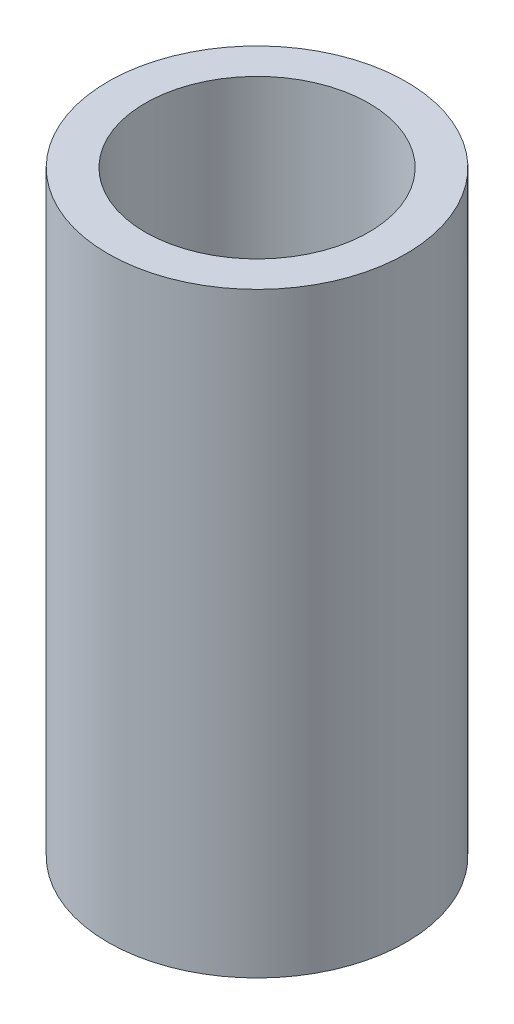
ISO-10303-21;
HEADER;
FILE_DESCRIPTION(('STEP AP214'),'2;1');
FILE_NAME('part.step','',(''),(''),'','','');
FILE_SCHEMA(('AUTOMOTIVE_DESIGN { 1 0 10303 214 1 1 1 1 }'));
ENDSEC;
DATA;
#1=APPLICATION_CONTEXT('core data for automotive mechanical design processes');
#2=APPLICATION_PROTOCOL_DEFINITION('international standard','automotive_design',2000,#1);
#3=PRODUCT_CONTEXT('',#1,'mechanical');
#4=PRODUCT('Part','Part','',(#3));
#5=PRODUCT_RELATED_PRODUCT_CATEGORY('part','',(#4));
#6=PRODUCT_DEFINITION_FORMATION('','',#4);
#7=PRODUCT_DEFINITION_CONTEXT('part definition',#1,'design');
#8=PRODUCT_DEFINITION('design','',#6,#7);
#9=PRODUCT_DEFINITION_SHAPE('','',#8);
#10=(LENGTH_UNIT() NAMED_UNIT(*) SI_UNIT(.MILLI.,.METRE.));
#11=(NAMED_UNIT(*) PLANE_ANGLE_UNIT() SI_UNIT($,.RADIAN.));
#12=(NAMED_UNIT(*) SI_UNIT($,.STERADIAN.) SOLID_ANGLE_UNIT());
#13=UNCERTAINTY_MEASURE_WITH_UNIT(LENGTH_MEASURE(1.E-05),#10,'distance_accuracy_value','');
#14=(GEOMETRIC_REPRESENTATION_CONTEXT(3) GLOBAL_UNCERTAINTY_ASSIGNED_CONTEXT((#13)) GLOBAL_UNIT_ASSIGNED_CONTEXT((#10,
#11,#12)) REPRESENTATION_CONTEXT('',''));
#15=CARTESIAN_POINT('',(0.,0.,0.));
#16=DIRECTION('',(0.,0.,1.));
#17=DIRECTION('',(1.,0.,0.));
#18=AXIS2_PLACEMENT_3D('',#15,#16,#17);
#19=CARTESIAN_POINT('',(0.,16.,0.));
#20=DIRECTION('',(0.,1.,0.));
#21=DIRECTION('',(0.,0.,1.));
#22=AXIS2_PLACEMENT_3D('',#19,#20,#21);
#23=PLANE('',#22);
#24=CARTESIAN_POINT('',(0.,16.,0.));
#25=DIRECTION('',(0.,1.,0.));
#26=DIRECTION('',(0.,0.,1.));
#27=AXIS2_PLACEMENT_3D('',#24,#25,#26);
#28=CIRCLE('',#27,4.);
#29=CARTESIAN_POINT('',(0.,16.,4.));
#30=VERTEX_POINT('',#29);
#31=EDGE_CURVE('E10',#30,#30,#28,.T.);
#32=ORIENTED_EDGE('',*,*,#31,.T.);
#33=EDGE_LOOP('',(#32));
#34=FACE_BOUND('',#33,.T.);
#35=CARTESIAN_POINT('',(0.,16.,0.));
#36=DIRECTION('',(0.,1.,0.));
#37=DIRECTION('',(0.,0.,1.));
#38=AXIS2_PLACEMENT_3D('',#35,#36,#37);
#39=CIRCLE('',#38,3.);
#40=CARTESIAN_POINT('',(0.,16.,3.));
#41=VERTEX_POINT('',#40);
#42=EDGE_CURVE('E58',#41,#41,#39,.T.);
#43=ORIENTED_EDGE('',*,*,#42,.F.);
#44=EDGE_LOOP('',(#43));
#45=FACE_BOUND('',#44,.T.);
#46=ADVANCED_FACE('F45',(#34,#45),#23,.T.);
#47=CARTESIAN_POINT('',(0.,0.,0.));
#48=DIRECTION('',(0.,1.,0.));
#49=DIRECTION('',(0.,0.,1.));
#50=AXIS2_PLACEMENT_3D('',#47,#48,#49);
#51=PLANE('',#50);
#52=CARTESIAN_POINT('',(0.,0.,0.));
#53=DIRECTION('',(0.,1.,0.));
#54=DIRECTION('',(0.,0.,1.));
#55=AXIS2_PLACEMENT_3D('',#52,#53,#54);
#56=CIRCLE('',#55,4.);
#57=CARTESIAN_POINT('',(0.,0.,4.));
#58=VERTEX_POINT('',#57);
#59=EDGE_CURVE('E49',#58,#58,#56,.T.);
#60=ORIENTED_EDGE('',*,*,#59,.F.);
#61=EDGE_LOOP('',(#60));
#62=FACE_BOUND('',#61,.T.);
#63=CARTESIAN_POINT('',(0.,0.,0.));
#64=DIRECTION('',(0.,1.,0.));
#65=DIRECTION('',(0.,0.,1.));
#66=AXIS2_PLACEMENT_3D('',#63,#64,#65);
#67=CIRCLE('',#66,3.);
#68=CARTESIAN_POINT('',(0.,0.,3.));
#69=VERTEX_POINT('',#68);
#70=EDGE_CURVE('E60',#69,#69,#67,.T.);
#71=ORIENTED_EDGE('',*,*,#70,.T.);
#72=EDGE_LOOP('',(#71));
#73=FACE_BOUND('',#72,.T.);
#74=ADVANCED_FACE('F72',(#62,#73),#51,.F.);
#75=CARTESIAN_POINT('',(0.,16.,0.));
#76=DIRECTION('',(0.,-1.,0.));
#77=DIRECTION('',(0.,0.,-1.));
#78=AXIS2_PLACEMENT_3D('',#75,#76,#77);
#79=CYLINDRICAL_SURFACE('',#78,4.);
#80=ORIENTED_EDGE('',*,*,#31,.F.);
#81=EDGE_LOOP('',(#80));
#82=FACE_BOUND('',#81,.T.);
#83=ORIENTED_EDGE('',*,*,#59,.T.);
#84=EDGE_LOOP('',(#83));
#85=FACE_BOUND('',#84,.T.);
#86=ADVANCED_FACE('F47',(#82,#85),#79,.T.);
#87=CARTESIAN_POINT('',(0.,16.,0.));
#88=DIRECTION('',(0.,-1.,0.));
#89=DIRECTION('',(0.,0.,-1.));
#90=AXIS2_PLACEMENT_3D('',#87,#88,#89);
#91=CYLINDRICAL_SURFACE('',#90,3.);
#92=ORIENTED_EDGE('',*,*,#42,.T.);
#93=EDGE_LOOP('',(#92));
#94=FACE_BOUND('',#93,.T.);
#95=ORIENTED_EDGE('',*,*,#70,.F.);
#96=EDGE_LOOP('',(#95));
#97=FACE_BOUND('',#96,.T.);
#98=ADVANCED_FACE('F68',(#94,#97),#91,.F.);
#99=CLOSED_SHELL('',(#46,#74,#86,#98));
#100=MANIFOLD_SOLID_BREP('B2',#99);
#101=ADVANCED_BREP_SHAPE_REPRESENTATION('',(#18,#100),#14);
#102=SHAPE_DEFINITION_REPRESENTATION(#9,#101);
ENDSEC;
END-ISO-10303-21;
